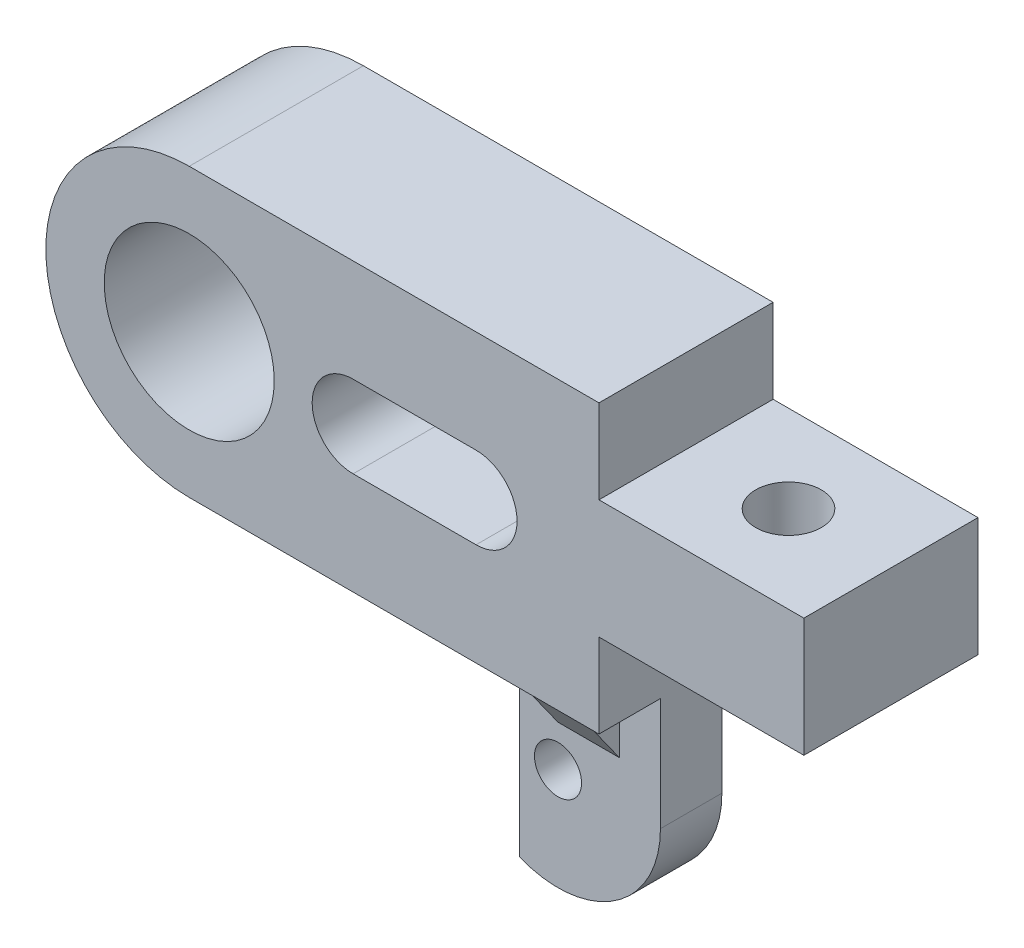
ISO-10303-21;
HEADER;
FILE_DESCRIPTION(('STEP AP214'),'2;1');
FILE_NAME('part.step','',(''),(''),'','','');
FILE_SCHEMA(('AUTOMOTIVE_DESIGN { 1 0 10303 214 1 1 1 1 }'));
ENDSEC;
DATA;
#1=APPLICATION_CONTEXT('core data for automotive mechanical design processes');
#2=APPLICATION_PROTOCOL_DEFINITION('international standard','automotive_design',2000,#1);
#3=PRODUCT_CONTEXT('',#1,'mechanical');
#4=PRODUCT('Part','Part','',(#3));
#5=PRODUCT_RELATED_PRODUCT_CATEGORY('part','',(#4));
#6=PRODUCT_DEFINITION_FORMATION('','',#4);
#7=PRODUCT_DEFINITION_CONTEXT('part definition',#1,'design');
#8=PRODUCT_DEFINITION('design','',#6,#7);
#9=PRODUCT_DEFINITION_SHAPE('','',#8);
#10=(LENGTH_UNIT() NAMED_UNIT(*) SI_UNIT(.MILLI.,.METRE.));
#11=(NAMED_UNIT(*) PLANE_ANGLE_UNIT() SI_UNIT($,.RADIAN.));
#12=(NAMED_UNIT(*) SI_UNIT($,.STERADIAN.) SOLID_ANGLE_UNIT());
#13=UNCERTAINTY_MEASURE_WITH_UNIT(LENGTH_MEASURE(1.E-05),#10,'distance_accuracy_value','');
#14=(GEOMETRIC_REPRESENTATION_CONTEXT(3) GLOBAL_UNCERTAINTY_ASSIGNED_CONTEXT((#13)) GLOBAL_UNIT_ASSIGNED_CONTEXT((#10,
#11,#12)) REPRESENTATION_CONTEXT('',''));
#15=CARTESIAN_POINT('',(0.,0.,0.));
#16=DIRECTION('',(0.,0.,1.));
#17=DIRECTION('',(1.,0.,0.));
#18=AXIS2_PLACEMENT_3D('',#15,#16,#17);
#19=CARTESIAN_POINT('',(15.,-12.5,-0.00100000000000013));
#20=DIRECTION('',(0.,0.,1.));
#21=DIRECTION('',(1.,0.,0.));
#22=AXIS2_PLACEMENT_3D('',#19,#20,#21);
#23=CYLINDRICAL_SURFACE('',#22,1.15);
#24=CARTESIAN_POINT('',(15.,-12.5,2.5));
#25=DIRECTION('',(0.,0.,1.));
#26=DIRECTION('',(1.,0.,0.));
#27=AXIS2_PLACEMENT_3D('',#24,#25,#26);
#28=CIRCLE('',#27,1.15);
#29=CARTESIAN_POINT('',(16.15,-12.5,2.5));
#30=VERTEX_POINT('',#29);
#31=EDGE_CURVE('E19',#30,#30,#28,.F.);
#32=ORIENTED_EDGE('',*,*,#31,.T.);
#33=EDGE_LOOP('',(#32));
#34=FACE_BOUND('',#33,.T.);
#35=CARTESIAN_POINT('',(15.,-12.5,5.5));
#36=DIRECTION('',(0.,0.,1.));
#37=DIRECTION('',(1.,0.,0.));
#38=AXIS2_PLACEMENT_3D('',#35,#36,#37);
#39=CIRCLE('',#38,1.15);
#40=CARTESIAN_POINT('',(16.15,-12.5,5.5));
#41=VERTEX_POINT('',#40);
#42=EDGE_CURVE('E126',#41,#41,#39,.T.);
#43=ORIENTED_EDGE('',*,*,#42,.T.);
#44=EDGE_LOOP('',(#43));
#45=FACE_BOUND('',#44,.T.);
#46=ADVANCED_FACE('F16',(#34,#45),#23,.F.);
#47=CARTESIAN_POINT('',(0.,0.,1.7));
#48=DIRECTION('',(0.,0.,1.));
#49=DIRECTION('',(1.,0.,0.));
#50=AXIS2_PLACEMENT_3D('',#47,#48,#49);
#51=CYLINDRICAL_SURFACE('',#50,4.15);
#52=CARTESIAN_POINT('',(0.,0.,8.5));
#53=DIRECTION('',(0.,0.,1.));
#54=DIRECTION('',(1.,0.,0.));
#55=AXIS2_PLACEMENT_3D('',#52,#53,#54);
#56=CIRCLE('',#55,4.15);
#57=CARTESIAN_POINT('',(4.15,0.,8.5));
#58=VERTEX_POINT('',#57);
#59=EDGE_CURVE('E131',#58,#58,#56,.T.);
#60=ORIENTED_EDGE('',*,*,#59,.T.);
#61=EDGE_LOOP('',(#60));
#62=FACE_BOUND('',#61,.T.);
#63=CARTESIAN_POINT('',(0.,0.,1.7));
#64=DIRECTION('',(0.,0.,1.));
#65=DIRECTION('',(1.,0.,0.));
#66=AXIS2_PLACEMENT_3D('',#63,#64,#65);
#67=CIRCLE('',#66,4.15);
#68=CARTESIAN_POINT('',(4.15,0.,1.7));
#69=VERTEX_POINT('',#68);
#70=EDGE_CURVE('E134',#69,#69,#67,.T.);
#71=ORIENTED_EDGE('',*,*,#70,.F.);
#72=EDGE_LOOP('',(#71));
#73=FACE_BOUND('',#72,.T.);
#74=ADVANCED_FACE('F763',(#62,#73),#51,.F.);
#75=CARTESIAN_POINT('',(25.,7.001,4.25));
#76=DIRECTION('',(0.,-1.,0.));
#77=DIRECTION('',(0.,0.,-1.));
#78=AXIS2_PLACEMENT_3D('',#75,#76,#77);
#79=CYLINDRICAL_SURFACE('',#78,1.6);
#80=CARTESIAN_POINT('',(25.,2.9,4.25));
#81=DIRECTION('',(0.,-1.,0.));
#82=DIRECTION('',(0.,0.,-1.));
#83=AXIS2_PLACEMENT_3D('',#80,#81,#82);
#84=CIRCLE('',#83,1.6);
#85=CARTESIAN_POINT('',(25.,2.9,2.65));
#86=VERTEX_POINT('',#85);
#87=EDGE_CURVE('E145',#86,#86,#84,.F.);
#88=ORIENTED_EDGE('',*,*,#87,.T.);
#89=EDGE_LOOP('',(#88));
#90=FACE_BOUND('',#89,.T.);
#91=CARTESIAN_POINT('',(25.,-2.9,4.25));
#92=DIRECTION('',(0.,-1.,0.));
#93=DIRECTION('',(0.,0.,-1.));
#94=AXIS2_PLACEMENT_3D('',#91,#92,#93);
#95=CIRCLE('',#94,1.6);
#96=CARTESIAN_POINT('',(25.,-2.9,2.65));
#97=VERTEX_POINT('',#96);
#98=EDGE_CURVE('E150',#97,#97,#95,.T.);
#99=ORIENTED_EDGE('',*,*,#98,.T.);
#100=EDGE_LOOP('',(#99));
#101=FACE_BOUND('',#100,.T.);
#102=ADVANCED_FACE('F755',(#90,#101),#79,.F.);
#103=CARTESIAN_POINT('',(15.,-12.5,-4.19445125392272));
#104=DIRECTION('',(0.,0.,1.));
#105=DIRECTION('',(1.,0.,0.));
#106=AXIS2_PLACEMENT_3D('',#103,#104,#105);
#107=CYLINDRICAL_SURFACE('',#106,5.);
#108=CARTESIAN_POINT('',(15.,-12.5,5.49999999999999));
#109=DIRECTION('',(0.,0.,1.));
#110=DIRECTION('',(1.,0.,0.));
#111=AXIS2_PLACEMENT_3D('',#108,#109,#110);
#112=CIRCLE('',#111,5.);
#113=CARTESIAN_POINT('',(20.,-12.5,5.49999999999999));
#114=VERTEX_POINT('',#113);
#115=CARTESIAN_POINT('',(13.12,-17.1330983153825,5.5));
#116=VERTEX_POINT('',#115);
#117=EDGE_CURVE('E99',#114,#116,#112,.F.);
#118=ORIENTED_EDGE('',*,*,#117,.T.);
#119=DIRECTION('',(0.,0.,-1.));
#120=VECTOR('',#119,1.);
#121=CARTESIAN_POINT('',(13.12,-17.1330983153825,-0.00100000000000013));
#122=LINE('',#121,#120);
#123=CARTESIAN_POINT('',(13.12,-17.1330983153825,2.5));
#124=VERTEX_POINT('',#123);
#125=EDGE_CURVE('E92',#116,#124,#122,.T.);
#126=ORIENTED_EDGE('',*,*,#125,.T.);
#127=CARTESIAN_POINT('',(15.,-12.5,2.5));
#128=DIRECTION('',(0.,0.,1.));
#129=DIRECTION('',(1.,0.,0.));
#130=AXIS2_PLACEMENT_3D('',#127,#128,#129);
#131=CIRCLE('',#130,5.);
#132=CARTESIAN_POINT('',(20.,-12.5,2.5));
#133=VERTEX_POINT('',#132);
#134=EDGE_CURVE('E97',#124,#133,#131,.T.);
#135=ORIENTED_EDGE('',*,*,#134,.T.);
#136=DIRECTION('',(0.,0.,1.));
#137=VECTOR('',#136,1.);
#138=CARTESIAN_POINT('',(20.,-12.5,8.5));
#139=LINE('',#138,#137);
#140=EDGE_CURVE('E235',#133,#114,#139,.T.);
#141=ORIENTED_EDGE('',*,*,#140,.T.);
#142=EDGE_LOOP('',(#118,#126,#135,#141));
#143=FACE_BOUND('',#142,.T.);
#144=ADVANCED_FACE('F94',(#143),#107,.T.);
#145=CARTESIAN_POINT('',(18.,0.,0.));
#146=DIRECTION('',(1.,0.,0.));
#147=DIRECTION('',(0.,0.,-1.));
#148=AXIS2_PLACEMENT_3D('',#145,#146,#147);
#149=PLANE('',#148);
#150=DIRECTION('',(0.,1.,0.));
#151=VECTOR('',#150,1.);
#152=CARTESIAN_POINT('',(18.,-15.,2.5));
#153=LINE('',#152,#151);
#154=CARTESIAN_POINT('',(18.,-7.,2.5));
#155=VERTEX_POINT('',#154);
#156=CARTESIAN_POINT('',(18.,-10.5,2.5));
#157=VERTEX_POINT('',#156);
#158=EDGE_CURVE('E121',#155,#157,#153,.F.);
#159=ORIENTED_EDGE('',*,*,#158,.T.);
#160=DIRECTION('',(0.,0.813733471206735,-0.581238193719096));
#161=VECTOR('',#160,1.);
#162=CARTESIAN_POINT('',(18.,-7.,0.));
#163=LINE('',#162,#161);
#164=CARTESIAN_POINT('',(18.,-7.,0.));
#165=VERTEX_POINT('',#164);
#166=EDGE_CURVE('E256',#165,#157,#163,.F.);
#167=ORIENTED_EDGE('',*,*,#166,.F.);
#168=DIRECTION('',(0.,0.,1.));
#169=VECTOR('',#168,1.);
#170=CARTESIAN_POINT('',(18.,-7.,8.5));
#171=LINE('',#170,#169);
#172=EDGE_CURVE('E247',#165,#155,#171,.T.);
#173=ORIENTED_EDGE('',*,*,#172,.T.);
#174=EDGE_LOOP('',(#159,#167,#173));
#175=FACE_BOUND('',#174,.T.);
#176=ADVANCED_FACE('F498',(#175),#149,.T.);
#177=CARTESIAN_POINT('',(15.,0.,8.));
#178=DIRECTION('',(1.,0.,0.));
#179=DIRECTION('',(0.,0.,-1.));
#180=AXIS2_PLACEMENT_3D('',#177,#178,#179);
#181=PLANE('',#180);
#182=DIRECTION('',(0.,1.,0.));
#183=VECTOR('',#182,1.);
#184=CARTESIAN_POINT('',(15.,-15.,5.5));
#185=LINE('',#184,#183);
#186=CARTESIAN_POINT('',(15.,-7.,5.5));
#187=VERTEX_POINT('',#186);
#188=CARTESIAN_POINT('',(15.,-10.5,5.5));
#189=VERTEX_POINT('',#188);
#190=EDGE_CURVE('E183',#187,#189,#185,.F.);
#191=ORIENTED_EDGE('',*,*,#190,.T.);
#192=DIRECTION('',(0.,0.813733471206735,0.581238193719096));
#193=VECTOR('',#192,1.);
#194=CARTESIAN_POINT('',(15.,-7.,8.));
#195=LINE('',#194,#193);
#196=CARTESIAN_POINT('',(15.,-7.,8.));
#197=VERTEX_POINT('',#196);
#198=EDGE_CURVE('E135',#189,#197,#195,.T.);
#199=ORIENTED_EDGE('',*,*,#198,.T.);
#200=DIRECTION('',(0.,0.,1.));
#201=VECTOR('',#200,1.);
#202=CARTESIAN_POINT('',(15.,-7.,8.5));
#203=LINE('',#202,#201);
#204=EDGE_CURVE('E255',#197,#187,#203,.F.);
#205=ORIENTED_EDGE('',*,*,#204,.T.);
#206=EDGE_LOOP('',(#191,#199,#205));
#207=FACE_BOUND('',#206,.T.);
#208=ADVANCED_FACE('F516',(#207),#181,.F.);
#209=CARTESIAN_POINT('',(13.12,-15.,-0.00100000000000013));
#210=DIRECTION('',(1.,0.,0.));
#211=DIRECTION('',(0.,0.,-1.));
#212=AXIS2_PLACEMENT_3D('',#209,#210,#211);
#213=PLANE('',#212);
#214=ORIENTED_EDGE('',*,*,#125,.F.);
#215=DIRECTION('',(0.,1.,0.));
#216=VECTOR('',#215,1.);
#217=CARTESIAN_POINT('',(13.12,-15.,5.5));
#218=LINE('',#217,#216);
#219=CARTESIAN_POINT('',(13.12,-7.,5.5));
#220=VERTEX_POINT('',#219);
#221=EDGE_CURVE('E130',#116,#220,#218,.T.);
#222=ORIENTED_EDGE('',*,*,#221,.T.);
#223=DIRECTION('',(0.,0.,1.));
#224=VECTOR('',#223,1.);
#225=CARTESIAN_POINT('',(13.12,-7.,8.5));
#226=LINE('',#225,#224);
#227=CARTESIAN_POINT('',(13.12,-7.,2.5));
#228=VERTEX_POINT('',#227);
#229=EDGE_CURVE('E109',#220,#228,#226,.F.);
#230=ORIENTED_EDGE('',*,*,#229,.T.);
#231=DIRECTION('',(0.,1.,0.));
#232=VECTOR('',#231,1.);
#233=CARTESIAN_POINT('',(13.12,-15.,2.5));
#234=LINE('',#233,#232);
#235=EDGE_CURVE('E106',#228,#124,#234,.F.);
#236=ORIENTED_EDGE('',*,*,#235,.T.);
#237=EDGE_LOOP('',(#214,#222,#230,#236));
#238=FACE_BOUND('',#237,.T.);
#239=ADVANCED_FACE('F107',(#238),#213,.F.);
#240=CARTESIAN_POINT('',(10.,-15.,2.5));
#241=DIRECTION('',(0.,0.,1.));
#242=DIRECTION('',(1.,0.,0.));
#243=AXIS2_PLACEMENT_3D('',#240,#241,#242);
#244=PLANE('',#243);
#245=ORIENTED_EDGE('',*,*,#158,.F.);
#246=DIRECTION('',(1.,0.,0.));
#247=VECTOR('',#246,1.);
#248=CARTESIAN_POINT('',(0.,-7.,2.5));
#249=LINE('',#248,#247);
#250=CARTESIAN_POINT('',(20.,-7.,2.5));
#251=VERTEX_POINT('',#250);
#252=EDGE_CURVE('E244',#155,#251,#249,.T.);
#253=ORIENTED_EDGE('',*,*,#252,.T.);
#254=DIRECTION('',(0.,1.,0.));
#255=VECTOR('',#254,1.);
#256=CARTESIAN_POINT('',(20.,-2.9,2.5));
#257=LINE('',#256,#255);
#258=EDGE_CURVE('E119',#251,#133,#257,.F.);
#259=ORIENTED_EDGE('',*,*,#258,.T.);
#260=ORIENTED_EDGE('',*,*,#134,.F.);
#261=ORIENTED_EDGE('',*,*,#235,.F.);
#262=DIRECTION('',(1.,0.,0.));
#263=VECTOR('',#262,1.);
#264=CARTESIAN_POINT('',(0.,-7.,2.5));
#265=LINE('',#264,#263);
#266=CARTESIAN_POINT('',(15.,-7.,2.5));
#267=VERTEX_POINT('',#266);
#268=EDGE_CURVE('E281',#228,#267,#265,.T.);
#269=ORIENTED_EDGE('',*,*,#268,.T.);
#270=DIRECTION('',(0.,1.,0.));
#271=VECTOR('',#270,1.);
#272=CARTESIAN_POINT('',(15.,0.,2.5));
#273=LINE('',#272,#271);
#274=CARTESIAN_POINT('',(15.,-10.5,2.5));
#275=VERTEX_POINT('',#274);
#276=EDGE_CURVE('E123',#267,#275,#273,.F.);
#277=ORIENTED_EDGE('',*,*,#276,.T.);
#278=DIRECTION('',(1.,0.,0.));
#279=VECTOR('',#278,1.);
#280=CARTESIAN_POINT('',(18.,-10.5,2.5));
#281=LINE('',#280,#279);
#282=EDGE_CURVE('E252',#157,#275,#281,.F.);
#283=ORIENTED_EDGE('',*,*,#282,.F.);
#284=EDGE_LOOP('',(#245,#253,#259,#260,#261,#269,#277,#283));
#285=FACE_BOUND('',#284,.T.);
#286=ORIENTED_EDGE('',*,*,#31,.F.);
#287=EDGE_LOOP('',(#286));
#288=FACE_BOUND('',#287,.T.);
#289=ADVANCED_FACE('F115',(#285,#288),#244,.F.);
#290=CARTESIAN_POINT('',(15.,0.,0.));
#291=DIRECTION('',(1.,0.,0.));
#292=DIRECTION('',(0.,0.,-1.));
#293=AXIS2_PLACEMENT_3D('',#290,#291,#292);
#294=PLANE('',#293);
#295=DIRECTION('',(0.,0.813733471206735,-0.581238193719096));
#296=VECTOR('',#295,1.);
#297=CARTESIAN_POINT('',(15.,-7.,0.));
#298=LINE('',#297,#296);
#299=CARTESIAN_POINT('',(15.,-7.,0.));
#300=VERTEX_POINT('',#299);
#301=EDGE_CURVE('E246',#275,#300,#298,.T.);
#302=ORIENTED_EDGE('',*,*,#301,.F.);
#303=ORIENTED_EDGE('',*,*,#276,.F.);
#304=DIRECTION('',(0.,0.,1.));
#305=VECTOR('',#304,1.);
#306=CARTESIAN_POINT('',(15.,-7.,8.5));
#307=LINE('',#306,#305);
#308=EDGE_CURVE('E287',#267,#300,#307,.F.);
#309=ORIENTED_EDGE('',*,*,#308,.T.);
#310=EDGE_LOOP('',(#302,#303,#309));
#311=FACE_BOUND('',#310,.T.);
#312=ADVANCED_FACE('F505',(#311),#294,.F.);
#313=CARTESIAN_POINT('',(10.,-15.,5.5));
#314=DIRECTION('',(0.,0.,-1.));
#315=DIRECTION('',(-1.,0.,0.));
#316=AXIS2_PLACEMENT_3D('',#313,#314,#315);
#317=PLANE('',#316);
#318=DIRECTION('',(0.,1.,0.));
#319=VECTOR('',#318,1.);
#320=CARTESIAN_POINT('',(18.,0.,5.5));
#321=LINE('',#320,#319);
#322=CARTESIAN_POINT('',(18.,-10.5,5.5));
#323=VERTEX_POINT('',#322);
#324=CARTESIAN_POINT('',(18.,-7.,5.5));
#325=VERTEX_POINT('',#324);
#326=EDGE_CURVE('E179',#323,#325,#321,.T.);
#327=ORIENTED_EDGE('',*,*,#326,.F.);
#328=DIRECTION('',(1.,0.,0.));
#329=VECTOR('',#328,1.);
#330=CARTESIAN_POINT('',(18.,-10.5,5.5));
#331=LINE('',#330,#329);
#332=EDGE_CURVE('E188',#323,#189,#331,.F.);
#333=ORIENTED_EDGE('',*,*,#332,.T.);
#334=ORIENTED_EDGE('',*,*,#190,.F.);
#335=DIRECTION('',(1.,0.,0.));
#336=VECTOR('',#335,1.);
#337=CARTESIAN_POINT('',(0.,-7.,5.5));
#338=LINE('',#337,#336);
#339=EDGE_CURVE('E269',#187,#220,#338,.F.);
#340=ORIENTED_EDGE('',*,*,#339,.T.);
#341=ORIENTED_EDGE('',*,*,#221,.F.);
#342=ORIENTED_EDGE('',*,*,#117,.F.);
#343=DIRECTION('',(0.,1.,0.));
#344=VECTOR('',#343,1.);
#345=CARTESIAN_POINT('',(20.,-2.9,5.5));
#346=LINE('',#345,#344);
#347=CARTESIAN_POINT('',(20.,-7.,5.5));
#348=VERTEX_POINT('',#347);
#349=EDGE_CURVE('E226',#114,#348,#346,.T.);
#350=ORIENTED_EDGE('',*,*,#349,.T.);
#351=DIRECTION('',(1.,0.,0.));
#352=VECTOR('',#351,1.);
#353=CARTESIAN_POINT('',(0.,-7.,5.5));
#354=LINE('',#353,#352);
#355=EDGE_CURVE('E176',#348,#325,#354,.F.);
#356=ORIENTED_EDGE('',*,*,#355,.T.);
#357=EDGE_LOOP('',(#327,#333,#334,#340,#341,#342,#350,#356));
#358=FACE_BOUND('',#357,.T.);
#359=ORIENTED_EDGE('',*,*,#42,.F.);
#360=EDGE_LOOP('',(#359));
#361=FACE_BOUND('',#360,.T.);
#362=ADVANCED_FACE('F511',(#358,#361),#317,.F.);
#363=CARTESIAN_POINT('',(18.,0.,8.));
#364=DIRECTION('',(1.,0.,0.));
#365=DIRECTION('',(0.,0.,-1.));
#366=AXIS2_PLACEMENT_3D('',#363,#364,#365);
#367=PLANE('',#366);
#368=DIRECTION('',(0.,0.813733471206735,0.581238193719096));
#369=VECTOR('',#368,1.);
#370=CARTESIAN_POINT('',(18.,-7.,8.));
#371=LINE('',#370,#369);
#372=CARTESIAN_POINT('',(18.,-7.,8.));
#373=VERTEX_POINT('',#372);
#374=EDGE_CURVE('E182',#373,#323,#371,.F.);
#375=ORIENTED_EDGE('',*,*,#374,.T.);
#376=ORIENTED_EDGE('',*,*,#326,.T.);
#377=DIRECTION('',(0.,0.,1.));
#378=VECTOR('',#377,1.);
#379=CARTESIAN_POINT('',(18.,-7.,8.5));
#380=LINE('',#379,#378);
#381=EDGE_CURVE('E173',#325,#373,#380,.T.);
#382=ORIENTED_EDGE('',*,*,#381,.T.);
#383=EDGE_LOOP('',(#375,#376,#382));
#384=FACE_BOUND('',#383,.T.);
#385=ADVANCED_FACE('F522',(#384),#367,.T.);
#386=CARTESIAN_POINT('',(18.,-7.,8.));
#387=DIRECTION('',(0.,0.581238193719096,-0.813733471206735));
#388=DIRECTION('',(0.,0.813733471206735,0.581238193719096));
#389=AXIS2_PLACEMENT_3D('',#386,#387,#388);
#390=PLANE('',#389);
#391=ORIENTED_EDGE('',*,*,#332,.F.);
#392=ORIENTED_EDGE('',*,*,#374,.F.);
#393=DIRECTION('',(1.,0.,0.));
#394=VECTOR('',#393,1.);
#395=CARTESIAN_POINT('',(0.,-7.,8.));
#396=LINE('',#395,#394);
#397=EDGE_CURVE('E158',#373,#197,#396,.F.);
#398=ORIENTED_EDGE('',*,*,#397,.T.);
#399=ORIENTED_EDGE('',*,*,#198,.F.);
#400=EDGE_LOOP('',(#391,#392,#398,#399));
#401=FACE_BOUND('',#400,.T.);
#402=ADVANCED_FACE('F519',(#401),#390,.F.);
#403=CARTESIAN_POINT('',(0.,0.,8.5));
#404=DIRECTION('',(0.,0.,-1.));
#405=DIRECTION('',(-1.,0.,0.));
#406=AXIS2_PLACEMENT_3D('',#403,#404,#405);
#407=PLANE('',#406);
#408=CARTESIAN_POINT('',(0.,0.,8.5));
#409=DIRECTION('',(0.,0.,-1.));
#410=DIRECTION('',(-1.,0.,0.));
#411=AXIS2_PLACEMENT_3D('',#408,#409,#410);
#412=CIRCLE('',#411,7.);
#413=CARTESIAN_POINT('',(0.,-7.,8.5));
#414=VERTEX_POINT('',#413);
#415=CARTESIAN_POINT('',(0.,7.,8.5));
#416=VERTEX_POINT('',#415);
#417=EDGE_CURVE('E155',#414,#416,#412,.T.);
#418=ORIENTED_EDGE('',*,*,#417,.F.);
#419=DIRECTION('',(1.,0.,0.));
#420=VECTOR('',#419,1.);
#421=CARTESIAN_POINT('',(0.,-7.,8.5));
#422=LINE('',#421,#420);
#423=CARTESIAN_POINT('',(20.,-7.,8.5));
#424=VERTEX_POINT('',#423);
#425=EDGE_CURVE('E296',#414,#424,#422,.T.);
#426=ORIENTED_EDGE('',*,*,#425,.T.);
#427=DIRECTION('',(0.,1.,0.));
#428=VECTOR('',#427,1.);
#429=CARTESIAN_POINT('',(20.,-2.9,8.5));
#430=LINE('',#429,#428);
#431=CARTESIAN_POINT('',(20.,-2.9,8.5));
#432=VERTEX_POINT('',#431);
#433=EDGE_CURVE('E229',#424,#432,#430,.T.);
#434=ORIENTED_EDGE('',*,*,#433,.T.);
#435=DIRECTION('',(1.,0.,0.));
#436=VECTOR('',#435,1.);
#437=CARTESIAN_POINT('',(30.,-2.9,8.5));
#438=LINE('',#437,#436);
#439=CARTESIAN_POINT('',(30.,-2.9,8.5));
#440=VERTEX_POINT('',#439);
#441=EDGE_CURVE('E153',#432,#440,#438,.T.);
#442=ORIENTED_EDGE('',*,*,#441,.T.);
#443=DIRECTION('',(0.,1.,0.));
#444=VECTOR('',#443,1.);
#445=CARTESIAN_POINT('',(30.,2.9,8.5));
#446=LINE('',#445,#444);
#447=CARTESIAN_POINT('',(30.,2.9,8.5));
#448=VERTEX_POINT('',#447);
#449=EDGE_CURVE('E216',#440,#448,#446,.T.);
#450=ORIENTED_EDGE('',*,*,#449,.T.);
#451=DIRECTION('',(1.,0.,0.));
#452=VECTOR('',#451,1.);
#453=CARTESIAN_POINT('',(20.,2.9,8.5));
#454=LINE('',#453,#452);
#455=CARTESIAN_POINT('',(20.,2.9,8.5));
#456=VERTEX_POINT('',#455);
#457=EDGE_CURVE('E148',#448,#456,#454,.F.);
#458=ORIENTED_EDGE('',*,*,#457,.T.);
#459=DIRECTION('',(0.,1.,0.));
#460=VECTOR('',#459,1.);
#461=CARTESIAN_POINT('',(20.,7.,8.5));
#462=LINE('',#461,#460);
#463=CARTESIAN_POINT('',(20.,7.,8.5));
#464=VERTEX_POINT('',#463);
#465=EDGE_CURVE('E206',#456,#464,#462,.T.);
#466=ORIENTED_EDGE('',*,*,#465,.T.);
#467=DIRECTION('',(1.,0.,0.));
#468=VECTOR('',#467,1.);
#469=CARTESIAN_POINT('',(0.,7.,8.5));
#470=LINE('',#469,#468);
#471=EDGE_CURVE('E200',#464,#416,#470,.F.);
#472=ORIENTED_EDGE('',*,*,#471,.T.);
#473=EDGE_LOOP('',(#418,#426,#434,#442,#450,#458,#466,#472));
#474=FACE_BOUND('',#473,.T.);
#475=ORIENTED_EDGE('',*,*,#59,.F.);
#476=EDGE_LOOP('',(#475));
#477=FACE_BOUND('',#476,.T.);
#478=CARTESIAN_POINT('',(8.,0.,8.5));
#479=DIRECTION('',(0.,0.,1.));
#480=DIRECTION('',(1.,0.,0.));
#481=AXIS2_PLACEMENT_3D('',#478,#479,#480);
#482=CIRCLE('',#481,2.);
#483=CARTESIAN_POINT('',(8.,-2.,8.5));
#484=VERTEX_POINT('',#483);
#485=CARTESIAN_POINT('',(8.,2.,8.5));
#486=VERTEX_POINT('',#485);
#487=EDGE_CURVE('E138',#484,#486,#482,.F.);
#488=ORIENTED_EDGE('',*,*,#487,.T.);
#489=DIRECTION('',(1.,0.,0.));
#490=VECTOR('',#489,1.);
#491=CARTESIAN_POINT('',(8.,2.,8.5));
#492=LINE('',#491,#490);
#493=CARTESIAN_POINT('',(14.,2.,8.5));
#494=VERTEX_POINT('',#493);
#495=EDGE_CURVE('E195',#486,#494,#492,.T.);
#496=ORIENTED_EDGE('',*,*,#495,.T.);
#497=CARTESIAN_POINT('',(14.,0.,8.5));
#498=DIRECTION('',(0.,0.,1.));
#499=DIRECTION('',(1.,0.,0.));
#500=AXIS2_PLACEMENT_3D('',#497,#498,#499);
#501=CIRCLE('',#500,2.);
#502=CARTESIAN_POINT('',(14.,-2.,8.5));
#503=VERTEX_POINT('',#502);
#504=EDGE_CURVE('E141',#494,#503,#501,.F.);
#505=ORIENTED_EDGE('',*,*,#504,.T.);
#506=DIRECTION('',(1.,0.,0.));
#507=VECTOR('',#506,1.);
#508=CARTESIAN_POINT('',(8.,-2.,8.5));
#509=LINE('',#508,#507);
#510=EDGE_CURVE('E140',#503,#484,#509,.F.);
#511=ORIENTED_EDGE('',*,*,#510,.T.);
#512=EDGE_LOOP('',(#488,#496,#505,#511));
#513=FACE_BOUND('',#512,.T.);
#514=ADVANCED_FACE('F418',(#474,#477,#513),#407,.F.);
#515=CARTESIAN_POINT('',(0.,0.,1.7));
#516=DIRECTION('',(0.,0.,1.));
#517=DIRECTION('',(1.,0.,0.));
#518=AXIS2_PLACEMENT_3D('',#515,#516,#517);
#519=PLANE('',#518);
#520=ORIENTED_EDGE('',*,*,#70,.T.);
#521=EDGE_LOOP('',(#520));
#522=FACE_BOUND('',#521,.T.);
#523=CARTESIAN_POINT('',(0.,0.,1.7));
#524=DIRECTION('',(0.,0.,-1.));
#525=DIRECTION('',(-1.,0.,0.));
#526=AXIS2_PLACEMENT_3D('',#523,#524,#525);
#527=CIRCLE('',#526,2.85);
#528=CARTESIAN_POINT('',(-2.85,0.,1.7));
#529=VERTEX_POINT('',#528);
#530=EDGE_CURVE('E159',#529,#529,#527,.T.);
#531=ORIENTED_EDGE('',*,*,#530,.T.);
#532=EDGE_LOOP('',(#531));
#533=FACE_BOUND('',#532,.T.);
#534=ADVANCED_FACE('F580',(#522,#533),#519,.T.);
#535=CARTESIAN_POINT('',(8.,0.,-0.000999999999999265));
#536=DIRECTION('',(0.,0.,1.));
#537=DIRECTION('',(1.,0.,0.));
#538=AXIS2_PLACEMENT_3D('',#535,#536,#537);
#539=CYLINDRICAL_SURFACE('',#538,2.);
#540=ORIENTED_EDGE('',*,*,#487,.F.);
#541=DIRECTION('',(0.,0.,-1.));
#542=VECTOR('',#541,1.);
#543=CARTESIAN_POINT('',(8.,-2.,-0.000999999999999265));
#544=LINE('',#543,#542);
#545=CARTESIAN_POINT('',(8.,-2.,0.));
#546=VERTEX_POINT('',#545);
#547=EDGE_CURVE('E194',#484,#546,#544,.T.);
#548=ORIENTED_EDGE('',*,*,#547,.T.);
#549=CARTESIAN_POINT('',(8.,0.,0.));
#550=DIRECTION('',(0.,0.,1.));
#551=DIRECTION('',(1.,0.,0.));
#552=AXIS2_PLACEMENT_3D('',#549,#550,#551);
#553=CIRCLE('',#552,2.);
#554=CARTESIAN_POINT('',(8.,2.,0.));
#555=VERTEX_POINT('',#554);
#556=EDGE_CURVE('E162',#555,#546,#553,.T.);
#557=ORIENTED_EDGE('',*,*,#556,.F.);
#558=DIRECTION('',(0.,0.,1.));
#559=VECTOR('',#558,1.);
#560=CARTESIAN_POINT('',(8.,2.,-0.000999999999999265));
#561=LINE('',#560,#559);
#562=EDGE_CURVE('E143',#555,#486,#561,.T.);
#563=ORIENTED_EDGE('',*,*,#562,.T.);
#564=EDGE_LOOP('',(#540,#548,#557,#563));
#565=FACE_BOUND('',#564,.T.);
#566=ADVANCED_FACE('F576',(#565),#539,.F.);
#567=CARTESIAN_POINT('',(8.,-2.,-0.000999999999999265));
#568=DIRECTION('',(0.,-1.,0.));
#569=DIRECTION('',(0.,0.,-1.));
#570=AXIS2_PLACEMENT_3D('',#567,#568,#569);
#571=PLANE('',#570);
#572=ORIENTED_EDGE('',*,*,#510,.F.);
#573=DIRECTION('',(0.,0.,1.));
#574=VECTOR('',#573,1.);
#575=CARTESIAN_POINT('',(14.,-2.,-0.000999999999999265));
#576=LINE('',#575,#574);
#577=CARTESIAN_POINT('',(14.,-2.,0.));
#578=VERTEX_POINT('',#577);
#579=EDGE_CURVE('E144',#503,#578,#576,.F.);
#580=ORIENTED_EDGE('',*,*,#579,.T.);
#581=DIRECTION('',(-1.,0.,0.));
#582=VECTOR('',#581,1.);
#583=CARTESIAN_POINT('',(0.,-2.,0.));
#584=LINE('',#583,#582);
#585=EDGE_CURVE('E165',#546,#578,#584,.F.);
#586=ORIENTED_EDGE('',*,*,#585,.F.);
#587=ORIENTED_EDGE('',*,*,#547,.F.);
#588=EDGE_LOOP('',(#572,#580,#586,#587));
#589=FACE_BOUND('',#588,.T.);
#590=ADVANCED_FACE('F572',(#589),#571,.F.);
#591=CARTESIAN_POINT('',(14.,0.,-0.000999999999999265));
#592=DIRECTION('',(0.,0.,1.));
#593=DIRECTION('',(1.,0.,0.));
#594=AXIS2_PLACEMENT_3D('',#591,#592,#593);
#595=CYLINDRICAL_SURFACE('',#594,2.);
#596=DIRECTION('',(0.,0.,1.));
#597=VECTOR('',#596,1.);
#598=CARTESIAN_POINT('',(14.,2.,-0.000999999999999265));
#599=LINE('',#598,#597);
#600=CARTESIAN_POINT('',(14.,2.,0.));
#601=VERTEX_POINT('',#600);
#602=EDGE_CURVE('E197',#494,#601,#599,.F.);
#603=ORIENTED_EDGE('',*,*,#602,.T.);
#604=CARTESIAN_POINT('',(14.,0.,0.));
#605=DIRECTION('',(0.,0.,1.));
#606=DIRECTION('',(1.,0.,0.));
#607=AXIS2_PLACEMENT_3D('',#604,#605,#606);
#608=CIRCLE('',#607,2.);
#609=EDGE_CURVE('E166',#578,#601,#608,.T.);
#610=ORIENTED_EDGE('',*,*,#609,.F.);
#611=ORIENTED_EDGE('',*,*,#579,.F.);
#612=ORIENTED_EDGE('',*,*,#504,.F.);
#613=EDGE_LOOP('',(#603,#610,#611,#612));
#614=FACE_BOUND('',#613,.T.);
#615=ADVANCED_FACE('F568',(#614),#595,.F.);
#616=CARTESIAN_POINT('',(8.,2.,-0.000999999999999265));
#617=DIRECTION('',(0.,1.,0.));
#618=DIRECTION('',(0.,0.,1.));
#619=AXIS2_PLACEMENT_3D('',#616,#617,#618);
#620=PLANE('',#619);
#621=ORIENTED_EDGE('',*,*,#495,.F.);
#622=ORIENTED_EDGE('',*,*,#562,.F.);
#623=DIRECTION('',(-1.,0.,0.));
#624=VECTOR('',#623,1.);
#625=CARTESIAN_POINT('',(0.,2.,0.));
#626=LINE('',#625,#624);
#627=EDGE_CURVE('E168',#601,#555,#626,.T.);
#628=ORIENTED_EDGE('',*,*,#627,.F.);
#629=ORIENTED_EDGE('',*,*,#602,.F.);
#630=EDGE_LOOP('',(#621,#622,#628,#629));
#631=FACE_BOUND('',#630,.T.);
#632=ADVANCED_FACE('F565',(#631),#620,.F.);
#633=CARTESIAN_POINT('',(0.,7.,8.5));
#634=DIRECTION('',(0.,-1.,0.));
#635=DIRECTION('',(0.,0.,-1.));
#636=AXIS2_PLACEMENT_3D('',#633,#634,#635);
#637=PLANE('',#636);
#638=DIRECTION('',(0.,0.,-1.));
#639=VECTOR('',#638,1.);
#640=CARTESIAN_POINT('',(0.,7.,8.5));
#641=LINE('',#640,#639);
#642=CARTESIAN_POINT('',(0.,7.,0.));
#643=VERTEX_POINT('',#642);
#644=EDGE_CURVE('E203',#416,#643,#641,.T.);
#645=ORIENTED_EDGE('',*,*,#644,.F.);
#646=ORIENTED_EDGE('',*,*,#471,.F.);
#647=DIRECTION('',(0.,0.,1.));
#648=VECTOR('',#647,1.);
#649=CARTESIAN_POINT('',(20.,7.,8.5));
#650=LINE('',#649,#648);
#651=CARTESIAN_POINT('',(20.,7.,0.));
#652=VERTEX_POINT('',#651);
#653=EDGE_CURVE('E149',#464,#652,#650,.F.);
#654=ORIENTED_EDGE('',*,*,#653,.T.);
#655=DIRECTION('',(-1.,0.,0.));
#656=VECTOR('',#655,1.);
#657=CARTESIAN_POINT('',(0.,7.,0.));
#658=LINE('',#657,#656);
#659=EDGE_CURVE('E169',#643,#652,#658,.F.);
#660=ORIENTED_EDGE('',*,*,#659,.F.);
#661=EDGE_LOOP('',(#645,#646,#654,#660));
#662=FACE_BOUND('',#661,.T.);
#663=ADVANCED_FACE('F423',(#662),#637,.F.);
#664=CARTESIAN_POINT('',(20.,7.,8.5));
#665=DIRECTION('',(-1.,0.,0.));
#666=DIRECTION('',(0.,0.,1.));
#667=AXIS2_PLACEMENT_3D('',#664,#665,#666);
#668=PLANE('',#667);
#669=ORIENTED_EDGE('',*,*,#653,.F.);
#670=ORIENTED_EDGE('',*,*,#465,.F.);
#671=DIRECTION('',(0.,0.,-1.));
#672=VECTOR('',#671,1.);
#673=CARTESIAN_POINT('',(20.,2.9,8.5));
#674=LINE('',#673,#672);
#675=CARTESIAN_POINT('',(20.,2.9,0.));
#676=VERTEX_POINT('',#675);
#677=EDGE_CURVE('E213',#456,#676,#674,.T.);
#678=ORIENTED_EDGE('',*,*,#677,.T.);
#679=DIRECTION('',(0.,1.,0.));
#680=VECTOR('',#679,1.);
#681=CARTESIAN_POINT('',(20.,0.,0.));
#682=LINE('',#681,#680);
#683=EDGE_CURVE('E321',#652,#676,#682,.F.);
#684=ORIENTED_EDGE('',*,*,#683,.F.);
#685=EDGE_LOOP('',(#669,#670,#678,#684));
#686=FACE_BOUND('',#685,.T.);
#687=ADVANCED_FACE('F559',(#686),#668,.F.);
#688=CARTESIAN_POINT('',(20.,2.9,8.5));
#689=DIRECTION('',(0.,-1.,0.));
#690=DIRECTION('',(0.,0.,-1.));
#691=AXIS2_PLACEMENT_3D('',#688,#689,#690);
#692=PLANE('',#691);
#693=ORIENTED_EDGE('',*,*,#677,.F.);
#694=ORIENTED_EDGE('',*,*,#457,.F.);
#695=DIRECTION('',(0.,0.,1.));
#696=VECTOR('',#695,1.);
#697=CARTESIAN_POINT('',(30.,2.9,8.5));
#698=LINE('',#697,#696);
#699=CARTESIAN_POINT('',(30.,2.9,0.));
#700=VERTEX_POINT('',#699);
#701=EDGE_CURVE('E154',#448,#700,#698,.F.);
#702=ORIENTED_EDGE('',*,*,#701,.T.);
#703=DIRECTION('',(-1.,0.,0.));
#704=VECTOR('',#703,1.);
#705=CARTESIAN_POINT('',(0.,2.9,0.));
#706=LINE('',#705,#704);
#707=EDGE_CURVE('E324',#676,#700,#706,.F.);
#708=ORIENTED_EDGE('',*,*,#707,.F.);
#709=EDGE_LOOP('',(#693,#694,#702,#708));
#710=FACE_BOUND('',#709,.T.);
#711=ORIENTED_EDGE('',*,*,#87,.F.);
#712=EDGE_LOOP('',(#711));
#713=FACE_BOUND('',#712,.T.);
#714=ADVANCED_FACE('F480',(#710,#713),#692,.F.);
#715=CARTESIAN_POINT('',(30.,2.9,8.5));
#716=DIRECTION('',(-1.,0.,0.));
#717=DIRECTION('',(0.,0.,1.));
#718=AXIS2_PLACEMENT_3D('',#715,#716,#717);
#719=PLANE('',#718);
#720=ORIENTED_EDGE('',*,*,#701,.F.);
#721=ORIENTED_EDGE('',*,*,#449,.F.);
#722=DIRECTION('',(0.,0.,1.));
#723=VECTOR('',#722,1.);
#724=CARTESIAN_POINT('',(30.,-2.9,8.5));
#725=LINE('',#724,#723);
#726=CARTESIAN_POINT('',(30.,-2.9,0.));
#727=VERTEX_POINT('',#726);
#728=EDGE_CURVE('E230',#440,#727,#725,.F.);
#729=ORIENTED_EDGE('',*,*,#728,.T.);
#730=DIRECTION('',(0.,1.,0.));
#731=VECTOR('',#730,1.);
#732=CARTESIAN_POINT('',(30.,0.,0.));
#733=LINE('',#732,#731);
#734=EDGE_CURVE('E333',#700,#727,#733,.F.);
#735=ORIENTED_EDGE('',*,*,#734,.F.);
#736=EDGE_LOOP('',(#720,#721,#729,#735));
#737=FACE_BOUND('',#736,.T.);
#738=ADVANCED_FACE('F484',(#737),#719,.F.);
#739=CARTESIAN_POINT('',(30.,-2.9,8.5));
#740=DIRECTION('',(0.,1.,0.));
#741=DIRECTION('',(0.,0.,1.));
#742=AXIS2_PLACEMENT_3D('',#739,#740,#741);
#743=PLANE('',#742);
#744=ORIENTED_EDGE('',*,*,#728,.F.);
#745=ORIENTED_EDGE('',*,*,#441,.F.);
#746=DIRECTION('',(0.,0.,1.));
#747=VECTOR('',#746,1.);
#748=CARTESIAN_POINT('',(20.,-2.9,8.5));
#749=LINE('',#748,#747);
#750=CARTESIAN_POINT('',(20.,-2.9,0.));
#751=VERTEX_POINT('',#750);
#752=EDGE_CURVE('E241',#432,#751,#749,.F.);
#753=ORIENTED_EDGE('',*,*,#752,.T.);
#754=DIRECTION('',(-1.,0.,0.));
#755=VECTOR('',#754,1.);
#756=CARTESIAN_POINT('',(0.,-2.9,0.));
#757=LINE('',#756,#755);
#758=EDGE_CURVE('E342',#727,#751,#757,.T.);
#759=ORIENTED_EDGE('',*,*,#758,.F.);
#760=EDGE_LOOP('',(#744,#745,#753,#759));
#761=FACE_BOUND('',#760,.T.);
#762=ORIENTED_EDGE('',*,*,#98,.F.);
#763=EDGE_LOOP('',(#762));
#764=FACE_BOUND('',#763,.T.);
#765=ADVANCED_FACE('F488',(#761,#764),#743,.F.);
#766=CARTESIAN_POINT('',(20.,-2.9,8.5));
#767=DIRECTION('',(-1.,0.,0.));
#768=DIRECTION('',(0.,0.,1.));
#769=AXIS2_PLACEMENT_3D('',#766,#767,#768);
#770=PLANE('',#769);
#771=ORIENTED_EDGE('',*,*,#258,.F.);
#772=DIRECTION('',(0.,0.,1.));
#773=VECTOR('',#772,1.);
#774=CARTESIAN_POINT('',(20.,-7.,8.5));
#775=LINE('',#774,#773);
#776=CARTESIAN_POINT('',(20.,-7.,0.));
#777=VERTEX_POINT('',#776);
#778=EDGE_CURVE('E237',#251,#777,#775,.F.);
#779=ORIENTED_EDGE('',*,*,#778,.T.);
#780=DIRECTION('',(0.,1.,0.));
#781=VECTOR('',#780,1.);
#782=CARTESIAN_POINT('',(20.,0.,0.));
#783=LINE('',#782,#781);
#784=EDGE_CURVE('E351',#751,#777,#783,.F.);
#785=ORIENTED_EDGE('',*,*,#784,.F.);
#786=ORIENTED_EDGE('',*,*,#752,.F.);
#787=ORIENTED_EDGE('',*,*,#433,.F.);
#788=DIRECTION('',(0.,0.,1.));
#789=VECTOR('',#788,1.);
#790=CARTESIAN_POINT('',(20.,-7.,8.5));
#791=LINE('',#790,#789);
#792=EDGE_CURVE('E223',#424,#348,#791,.F.);
#793=ORIENTED_EDGE('',*,*,#792,.T.);
#794=ORIENTED_EDGE('',*,*,#349,.F.);
#795=ORIENTED_EDGE('',*,*,#140,.F.);
#796=EDGE_LOOP('',(#771,#779,#785,#786,#787,#793,#794,#795));
#797=FACE_BOUND('',#796,.T.);
#798=ADVANCED_FACE('F492',(#797),#770,.F.);
#799=CARTESIAN_POINT('',(0.,-7.,8.5));
#800=DIRECTION('',(0.,1.,0.));
#801=DIRECTION('',(0.,0.,1.));
#802=AXIS2_PLACEMENT_3D('',#799,#800,#801);
#803=PLANE('',#802);
#804=ORIENTED_EDGE('',*,*,#172,.F.);
#805=DIRECTION('',(-1.,0.,0.));
#806=VECTOR('',#805,1.);
#807=CARTESIAN_POINT('',(0.,-7.,0.));
#808=LINE('',#807,#806);
#809=EDGE_CURVE('E360',#777,#165,#808,.T.);
#810=ORIENTED_EDGE('',*,*,#809,.F.);
#811=ORIENTED_EDGE('',*,*,#778,.F.);
#812=ORIENTED_EDGE('',*,*,#252,.F.);
#813=EDGE_LOOP('',(#804,#810,#811,#812));
#814=FACE_BOUND('',#813,.T.);
#815=ADVANCED_FACE('F497',(#814),#803,.F.);
#816=CARTESIAN_POINT('',(18.,-7.,0.));
#817=DIRECTION('',(0.,-0.581238193719096,-0.813733471206735));
#818=DIRECTION('',(0.,0.813733471206735,-0.581238193719096));
#819=AXIS2_PLACEMENT_3D('',#816,#817,#818);
#820=PLANE('',#819);
#821=ORIENTED_EDGE('',*,*,#166,.T.);
#822=ORIENTED_EDGE('',*,*,#282,.T.);
#823=ORIENTED_EDGE('',*,*,#301,.T.);
#824=DIRECTION('',(-1.,0.,0.));
#825=VECTOR('',#824,1.);
#826=CARTESIAN_POINT('',(0.,-7.,0.));
#827=LINE('',#826,#825);
#828=EDGE_CURVE('E373',#165,#300,#827,.T.);
#829=ORIENTED_EDGE('',*,*,#828,.F.);
#830=EDGE_LOOP('',(#821,#822,#823,#829));
#831=FACE_BOUND('',#830,.T.);
#832=ADVANCED_FACE('F501',(#831),#820,.T.);
#833=CARTESIAN_POINT('',(0.,-7.,8.5));
#834=DIRECTION('',(0.,1.,0.));
#835=DIRECTION('',(0.,0.,1.));
#836=AXIS2_PLACEMENT_3D('',#833,#834,#835);
#837=PLANE('',#836);
#838=ORIENTED_EDGE('',*,*,#381,.F.);
#839=ORIENTED_EDGE('',*,*,#355,.F.);
#840=ORIENTED_EDGE('',*,*,#792,.F.);
#841=ORIENTED_EDGE('',*,*,#425,.F.);
#842=DIRECTION('',(0.,0.,-1.));
#843=VECTOR('',#842,1.);
#844=CARTESIAN_POINT('',(0.,-7.,8.5));
#845=LINE('',#844,#843);
#846=CARTESIAN_POINT('',(0.,-7.,0.));
#847=VERTEX_POINT('',#846);
#848=EDGE_CURVE('E157',#847,#414,#845,.F.);
#849=ORIENTED_EDGE('',*,*,#848,.F.);
#850=DIRECTION('',(-1.,0.,0.));
#851=VECTOR('',#850,1.);
#852=CARTESIAN_POINT('',(0.,-7.,0.));
#853=LINE('',#852,#851);
#854=EDGE_CURVE('E25',#300,#847,#853,.T.);
#855=ORIENTED_EDGE('',*,*,#854,.F.);
#856=ORIENTED_EDGE('',*,*,#308,.F.);
#857=ORIENTED_EDGE('',*,*,#268,.F.);
#858=ORIENTED_EDGE('',*,*,#229,.F.);
#859=ORIENTED_EDGE('',*,*,#339,.F.);
#860=ORIENTED_EDGE('',*,*,#204,.F.);
#861=ORIENTED_EDGE('',*,*,#397,.F.);
#862=EDGE_LOOP('',(#838,#839,#840,#841,#849,#855,#856,#857,#858,#859,#860,#861));
#863=FACE_BOUND('',#862,.T.);
#864=ADVANCED_FACE('F409',(#863),#837,.F.);
#865=CARTESIAN_POINT('',(0.,0.,8.5));
#866=DIRECTION('',(0.,0.,-1.));
#867=DIRECTION('',(-1.,0.,0.));
#868=AXIS2_PLACEMENT_3D('',#865,#866,#867);
#869=CYLINDRICAL_SURFACE('',#868,7.);
#870=CARTESIAN_POINT('',(0.,0.,0.));
#871=DIRECTION('',(0.,0.,-1.));
#872=DIRECTION('',(-1.,0.,0.));
#873=AXIS2_PLACEMENT_3D('',#870,#871,#872);
#874=CIRCLE('',#873,7.);
#875=EDGE_CURVE('E34',#847,#643,#874,.T.);
#876=ORIENTED_EDGE('',*,*,#875,.F.);
#877=ORIENTED_EDGE('',*,*,#848,.T.);
#878=ORIENTED_EDGE('',*,*,#417,.T.);
#879=ORIENTED_EDGE('',*,*,#644,.T.);
#880=EDGE_LOOP('',(#876,#877,#878,#879));
#881=FACE_BOUND('',#880,.T.);
#882=ADVANCED_FACE('F413',(#881),#869,.T.);
#883=CARTESIAN_POINT('',(0.,0.,8.5));
#884=DIRECTION('',(0.,0.,-1.));
#885=DIRECTION('',(-1.,0.,0.));
#886=AXIS2_PLACEMENT_3D('',#883,#884,#885);
#887=CYLINDRICAL_SURFACE('',#886,2.85);
#888=ORIENTED_EDGE('',*,*,#530,.F.);
#889=EDGE_LOOP('',(#888));
#890=FACE_BOUND('',#889,.T.);
#891=CARTESIAN_POINT('',(0.,0.,0.));
#892=DIRECTION('',(0.,0.,-1.));
#893=DIRECTION('',(-1.,0.,0.));
#894=AXIS2_PLACEMENT_3D('',#891,#892,#893);
#895=CIRCLE('',#894,2.85);
#896=CARTESIAN_POINT('',(-2.85,0.,0.));
#897=VERTEX_POINT('',#896);
#898=EDGE_CURVE('E11',#897,#897,#895,.F.);
#899=ORIENTED_EDGE('',*,*,#898,.F.);
#900=EDGE_LOOP('',(#899));
#901=FACE_BOUND('',#900,.T.);
#902=ADVANCED_FACE('F534',(#890,#901),#887,.F.);
#903=CARTESIAN_POINT('',(0.,0.,0.));
#904=DIRECTION('',(0.,0.,-1.));
#905=DIRECTION('',(-1.,0.,0.));
#906=AXIS2_PLACEMENT_3D('',#903,#904,#905);
#907=PLANE('',#906);
#908=ORIENTED_EDGE('',*,*,#898,.T.);
#909=EDGE_LOOP('',(#908));
#910=FACE_BOUND('',#909,.T.);
#911=ORIENTED_EDGE('',*,*,#854,.T.);
#912=ORIENTED_EDGE('',*,*,#875,.T.);
#913=ORIENTED_EDGE('',*,*,#659,.T.);
#914=ORIENTED_EDGE('',*,*,#683,.T.);
#915=ORIENTED_EDGE('',*,*,#707,.T.);
#916=ORIENTED_EDGE('',*,*,#734,.T.);
#917=ORIENTED_EDGE('',*,*,#758,.T.);
#918=ORIENTED_EDGE('',*,*,#784,.T.);
#919=ORIENTED_EDGE('',*,*,#809,.T.);
#920=ORIENTED_EDGE('',*,*,#828,.T.);
#921=EDGE_LOOP('',(#911,#912,#913,#914,#915,#916,#917,#918,#919,#920));
#922=FACE_BOUND('',#921,.T.);
#923=ORIENTED_EDGE('',*,*,#609,.T.);
#924=ORIENTED_EDGE('',*,*,#627,.T.);
#925=ORIENTED_EDGE('',*,*,#556,.T.);
#926=ORIENTED_EDGE('',*,*,#585,.T.);
#927=EDGE_LOOP('',(#923,#924,#925,#926));
#928=FACE_BOUND('',#927,.T.);
#929=ADVANCED_FACE('F403',(#910,#922,#928),#907,.T.);
#930=CLOSED_SHELL('',(#46,#74,#102,#144,#176,#208,#239,#289,#312,#362,#385,#402,#514,#534,#566,
#590,#615,#632,#663,#687,#714,#738,#765,#798,#815,#832,#864,#882,#902,#929));
#931=MANIFOLD_SOLID_BREP('B1',#930);
#932=ADVANCED_BREP_SHAPE_REPRESENTATION('',(#18,#931),#14);
#933=SHAPE_DEFINITION_REPRESENTATION(#9,#932);
ENDSEC;
END-ISO-10303-21;
